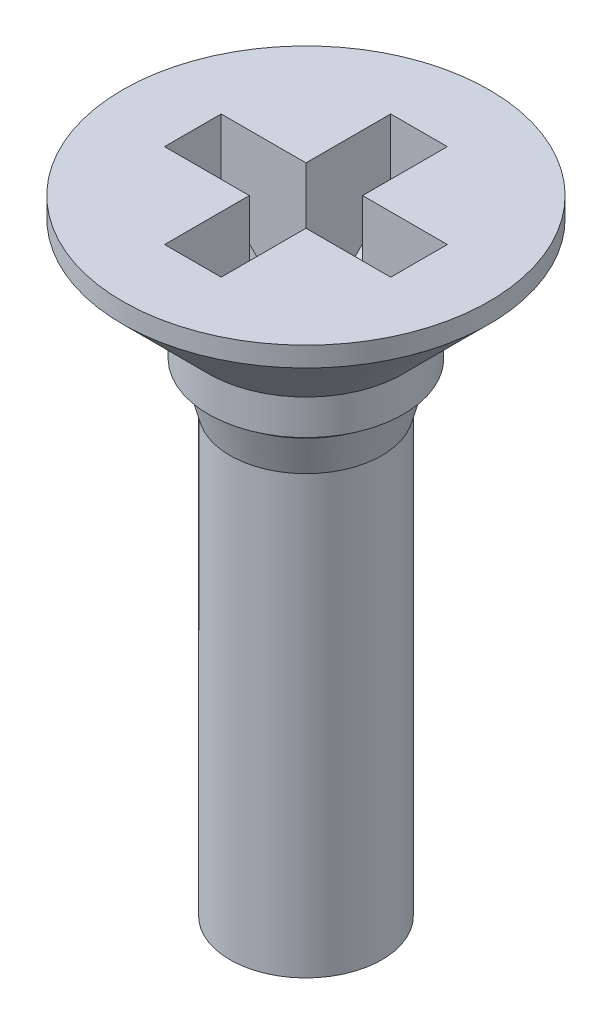
ISO-10303-21;
HEADER;
FILE_DESCRIPTION(('STEP AP214'),'2;1');
FILE_NAME('part.step','',(''),(''),'','','');
FILE_SCHEMA(('AUTOMOTIVE_DESIGN { 1 0 10303 214 1 1 1 1 }'));
ENDSEC;
DATA;
#1=APPLICATION_CONTEXT('core data for automotive mechanical design processes');
#2=APPLICATION_PROTOCOL_DEFINITION('international standard','automotive_design',2000,#1);
#3=PRODUCT_CONTEXT('',#1,'mechanical');
#4=PRODUCT('Part','Part','',(#3));
#5=PRODUCT_RELATED_PRODUCT_CATEGORY('part','',(#4));
#6=PRODUCT_DEFINITION_FORMATION('','',#4);
#7=PRODUCT_DEFINITION_CONTEXT('part definition',#1,'design');
#8=PRODUCT_DEFINITION('design','',#6,#7);
#9=PRODUCT_DEFINITION_SHAPE('','',#8);
#10=(LENGTH_UNIT() NAMED_UNIT(*) SI_UNIT(.MILLI.,.METRE.));
#11=(NAMED_UNIT(*) PLANE_ANGLE_UNIT() SI_UNIT($,.RADIAN.));
#12=(NAMED_UNIT(*) SI_UNIT($,.STERADIAN.) SOLID_ANGLE_UNIT());
#13=UNCERTAINTY_MEASURE_WITH_UNIT(LENGTH_MEASURE(1.E-05),#10,'distance_accuracy_value','');
#14=(GEOMETRIC_REPRESENTATION_CONTEXT(3) GLOBAL_UNCERTAINTY_ASSIGNED_CONTEXT((#13)) GLOBAL_UNIT_ASSIGNED_CONTEXT((#10,
#11,#12)) REPRESENTATION_CONTEXT('',''));
#15=CARTESIAN_POINT('',(0.,0.,0.));
#16=DIRECTION('',(0.,0.,1.));
#17=DIRECTION('',(1.,0.,0.));
#18=AXIS2_PLACEMENT_3D('',#15,#16,#17);
#19=CARTESIAN_POINT('',(0.,-2.35,-0.363));
#20=DIRECTION('',(0.,0.,-1.));
#21=DIRECTION('',(-1.,0.,0.));
#22=AXIS2_PLACEMENT_3D('',#19,#20,#21);
#23=PLANE('',#22);
#24=DIRECTION('',(0.,1.,0.));
#25=VECTOR('',#24,1.);
#26=CARTESIAN_POINT('',(0.363,-2.35,-0.363));
#27=LINE('',#26,#25);
#28=CARTESIAN_POINT('',(0.363,-1.8,-0.363));
#29=VERTEX_POINT('',#28);
#30=CARTESIAN_POINT('',(0.363,0.,-0.363));
#31=VERTEX_POINT('',#30);
#32=EDGE_CURVE('E196',#29,#31,#27,.T.);
#33=ORIENTED_EDGE('',*,*,#32,.F.);
#34=DIRECTION('',(1.,0.,0.));
#35=VECTOR('',#34,1.);
#36=CARTESIAN_POINT('',(-0.550000000000001,-1.8,-0.363));
#37=LINE('',#36,#35);
#38=CARTESIAN_POINT('',(0.550000000000001,-1.8,-0.363));
#39=VERTEX_POINT('',#38);
#40=EDGE_CURVE('E231',#29,#39,#37,.T.);
#41=ORIENTED_EDGE('',*,*,#40,.T.);
#42=DIRECTION('',(0.707106781186547,0.707106781186548,0.));
#43=VECTOR('',#42,1.);
#44=CARTESIAN_POINT('',(1.45,-0.9,-0.363));
#45=LINE('',#44,#43);
#46=CARTESIAN_POINT('',(1.45,-0.9,-0.363));
#47=VERTEX_POINT('',#46);
#48=EDGE_CURVE('E235',#39,#47,#45,.T.);
#49=ORIENTED_EDGE('',*,*,#48,.T.);
#50=DIRECTION('',(0.,1.,0.));
#51=VECTOR('',#50,1.);
#52=CARTESIAN_POINT('',(1.45,0.,-0.363));
#53=LINE('',#52,#51);
#54=CARTESIAN_POINT('',(1.45,0.,-0.363));
#55=VERTEX_POINT('',#54);
#56=EDGE_CURVE('E238',#47,#55,#53,.T.);
#57=ORIENTED_EDGE('',*,*,#56,.T.);
#58=DIRECTION('',(-1.,0.,0.));
#59=VECTOR('',#58,1.);
#60=CARTESIAN_POINT('',(1.45,0.,-0.363));
#61=LINE('',#60,#59);
#62=EDGE_CURVE('E242',#55,#31,#61,.T.);
#63=ORIENTED_EDGE('',*,*,#62,.T.);
#64=EDGE_LOOP('',(#33,#41,#49,#57,#63));
#65=FACE_BOUND('',#64,.T.);
#66=ADVANCED_FACE('F34',(#65),#23,.F.);
#67=CARTESIAN_POINT('',(0.,-2.35,0.363));
#68=DIRECTION('',(0.,0.,-1.));
#69=DIRECTION('',(-1.,0.,0.));
#70=AXIS2_PLACEMENT_3D('',#67,#68,#69);
#71=PLANE('',#70);
#72=DIRECTION('',(1.,0.,0.));
#73=VECTOR('',#72,1.);
#74=CARTESIAN_POINT('',(-0.550000000000001,-1.8,0.363));
#75=LINE('',#74,#73);
#76=CARTESIAN_POINT('',(0.363,-1.8,0.363));
#77=VERTEX_POINT('',#76);
#78=CARTESIAN_POINT('',(0.550000000000001,-1.8,0.363));
#79=VERTEX_POINT('',#78);
#80=EDGE_CURVE('E213',#77,#79,#75,.T.);
#81=ORIENTED_EDGE('',*,*,#80,.F.);
#82=DIRECTION('',(0.,1.,0.));
#83=VECTOR('',#82,1.);
#84=CARTESIAN_POINT('',(0.363,-2.35,0.363));
#85=LINE('',#84,#83);
#86=CARTESIAN_POINT('',(0.363,0.,0.363));
#87=VERTEX_POINT('',#86);
#88=EDGE_CURVE('E42',#77,#87,#85,.T.);
#89=ORIENTED_EDGE('',*,*,#88,.T.);
#90=DIRECTION('',(-1.,0.,0.));
#91=VECTOR('',#90,1.);
#92=CARTESIAN_POINT('',(1.45,0.,0.363));
#93=LINE('',#92,#91);
#94=CARTESIAN_POINT('',(1.45,0.,0.363));
#95=VERTEX_POINT('',#94);
#96=EDGE_CURVE('E222',#95,#87,#93,.T.);
#97=ORIENTED_EDGE('',*,*,#96,.F.);
#98=DIRECTION('',(0.,1.,0.));
#99=VECTOR('',#98,1.);
#100=CARTESIAN_POINT('',(1.45,0.,0.363));
#101=LINE('',#100,#99);
#102=CARTESIAN_POINT('',(1.45,-0.9,0.363));
#103=VERTEX_POINT('',#102);
#104=EDGE_CURVE('E219',#103,#95,#101,.T.);
#105=ORIENTED_EDGE('',*,*,#104,.F.);
#106=DIRECTION('',(0.707106781186547,0.707106781186548,0.));
#107=VECTOR('',#106,1.);
#108=CARTESIAN_POINT('',(1.45,-0.9,0.363));
#109=LINE('',#108,#107);
#110=EDGE_CURVE('E216',#79,#103,#109,.T.);
#111=ORIENTED_EDGE('',*,*,#110,.F.);
#112=EDGE_LOOP('',(#81,#89,#97,#105,#111));
#113=FACE_BOUND('',#112,.T.);
#114=ADVANCED_FACE('F288',(#113),#71,.T.);
#115=CARTESIAN_POINT('',(0.974000000000001,-8.,0.));
#116=DIRECTION('',(0.,1.,0.));
#117=DIRECTION('',(-1.,0.,0.));
#118=AXIS2_PLACEMENT_3D('',#115,#116,#117);
#119=PLANE('',#118);
#120=CARTESIAN_POINT('',(0.,-8.,0.));
#121=DIRECTION('',(0.,1.,0.));
#122=DIRECTION('',(-1.,0.,0.));
#123=AXIS2_PLACEMENT_3D('',#120,#121,#122);
#124=CIRCLE('',#123,0.974);
#125=CARTESIAN_POINT('',(-0.974,-8.,0.));
#126=VERTEX_POINT('',#125);
#127=EDGE_CURVE('E284',#126,#126,#124,.T.);
#128=ORIENTED_EDGE('',*,*,#127,.F.);
#129=EDGE_LOOP('',(#128));
#130=FACE_BOUND('',#129,.T.);
#131=ADVANCED_FACE('F36',(#130),#119,.F.);
#132=CARTESIAN_POINT('',(0.,0.,0.));
#133=DIRECTION('',(0.,1.,0.));
#134=DIRECTION('',(-1.,0.,0.));
#135=AXIS2_PLACEMENT_3D('',#132,#133,#134);
#136=CYLINDRICAL_SURFACE('',#135,0.974);
#137=CARTESIAN_POINT('',(0.,-2.4,0.));
#138=DIRECTION('',(0.,1.,0.));
#139=DIRECTION('',(-1.,0.,0.));
#140=AXIS2_PLACEMENT_3D('',#137,#138,#139);
#141=CIRCLE('',#140,0.974);
#142=CARTESIAN_POINT('',(-0.974,-2.4,0.));
#143=VERTEX_POINT('',#142);
#144=EDGE_CURVE('E281',#143,#143,#141,.T.);
#145=ORIENTED_EDGE('',*,*,#144,.F.);
#146=EDGE_LOOP('',(#145));
#147=FACE_BOUND('',#146,.T.);
#148=ORIENTED_EDGE('',*,*,#127,.T.);
#149=EDGE_LOOP('',(#148));
#150=FACE_BOUND('',#149,.T.);
#151=ADVANCED_FACE('F396',(#147,#150),#136,.T.);
#152=CARTESIAN_POINT('',(0.,-2.4,0.));
#153=DIRECTION('',(0.,1.,0.));
#154=DIRECTION('',(-1.,0.,0.));
#155=AXIS2_PLACEMENT_3D('',#152,#153,#154);
#156=CONICAL_SURFACE('',#155,0.974,0.26179938779915);
#157=CARTESIAN_POINT('',(0.,-1.91483339501605,0.));
#158=DIRECTION('',(0.,1.,0.));
#159=DIRECTION('',(-1.,0.,0.));
#160=AXIS2_PLACEMENT_3D('',#157,#158,#159);
#161=CIRCLE('',#160,1.104);
#162=CARTESIAN_POINT('',(-1.104,-1.91483339501605,0.));
#163=VERTEX_POINT('',#162);
#164=EDGE_CURVE('E278',#163,#163,#161,.T.);
#165=ORIENTED_EDGE('',*,*,#164,.F.);
#166=EDGE_LOOP('',(#165));
#167=FACE_BOUND('',#166,.T.);
#168=ORIENTED_EDGE('',*,*,#144,.T.);
#169=EDGE_LOOP('',(#168));
#170=FACE_BOUND('',#169,.T.);
#171=ADVANCED_FACE('F393',(#167,#170),#156,.T.);
#172=CARTESIAN_POINT('',(0.,0.,0.));
#173=DIRECTION('',(0.,1.,0.));
#174=DIRECTION('',(-1.,0.,0.));
#175=AXIS2_PLACEMENT_3D('',#172,#173,#174);
#176=CYLINDRICAL_SURFACE('',#175,1.104);
#177=CARTESIAN_POINT('',(0.,-1.804,0.));
#178=DIRECTION('',(0.,1.,0.));
#179=DIRECTION('',(-1.,0.,0.));
#180=AXIS2_PLACEMENT_3D('',#177,#178,#179);
#181=CIRCLE('',#180,1.104);
#182=CARTESIAN_POINT('',(-1.104,-1.804,0.));
#183=VERTEX_POINT('',#182);
#184=EDGE_CURVE('E275',#183,#183,#181,.T.);
#185=ORIENTED_EDGE('',*,*,#184,.F.);
#186=EDGE_LOOP('',(#185));
#187=FACE_BOUND('',#186,.T.);
#188=ORIENTED_EDGE('',*,*,#164,.T.);
#189=EDGE_LOOP('',(#188));
#190=FACE_BOUND('',#189,.T.);
#191=ADVANCED_FACE('F389',(#187,#190),#176,.T.);
#192=CARTESIAN_POINT('',(1.25,-1.804,0.));
#193=DIRECTION('',(0.,1.,0.));
#194=DIRECTION('',(-1.,0.,0.));
#195=AXIS2_PLACEMENT_3D('',#192,#193,#194);
#196=PLANE('',#195);
#197=CARTESIAN_POINT('',(0.,-1.804,0.));
#198=DIRECTION('',(0.,1.,0.));
#199=DIRECTION('',(-1.,0.,0.));
#200=AXIS2_PLACEMENT_3D('',#197,#198,#199);
#201=CIRCLE('',#200,1.25);
#202=CARTESIAN_POINT('',(-1.25,-1.804,0.));
#203=VERTEX_POINT('',#202);
#204=EDGE_CURVE('E272',#203,#203,#201,.T.);
#205=ORIENTED_EDGE('',*,*,#204,.F.);
#206=EDGE_LOOP('',(#205));
#207=FACE_BOUND('',#206,.T.);
#208=ORIENTED_EDGE('',*,*,#184,.T.);
#209=EDGE_LOOP('',(#208));
#210=FACE_BOUND('',#209,.T.);
#211=ADVANCED_FACE('F385',(#207,#210),#196,.F.);
#212=CARTESIAN_POINT('',(0.,0.,0.));
#213=DIRECTION('',(0.,1.,0.));
#214=DIRECTION('',(-1.,0.,0.));
#215=AXIS2_PLACEMENT_3D('',#212,#213,#214);
#216=CYLINDRICAL_SURFACE('',#215,1.25);
#217=CARTESIAN_POINT('',(0.,-1.354,0.));
#218=DIRECTION('',(0.,1.,0.));
#219=DIRECTION('',(-1.,0.,0.));
#220=AXIS2_PLACEMENT_3D('',#217,#218,#219);
#221=CIRCLE('',#220,1.25);
#222=CARTESIAN_POINT('',(-1.25,-1.354,0.));
#223=VERTEX_POINT('',#222);
#224=EDGE_CURVE('E269',#223,#223,#221,.T.);
#225=ORIENTED_EDGE('',*,*,#224,.F.);
#226=EDGE_LOOP('',(#225));
#227=FACE_BOUND('',#226,.T.);
#228=ORIENTED_EDGE('',*,*,#204,.T.);
#229=EDGE_LOOP('',(#228));
#230=FACE_BOUND('',#229,.T.);
#231=ADVANCED_FACE('F381',(#227,#230),#216,.T.);
#232=CARTESIAN_POINT('',(0.,-1.354,0.));
#233=DIRECTION('',(0.,1.,0.));
#234=DIRECTION('',(-1.,0.,0.));
#235=AXIS2_PLACEMENT_3D('',#232,#233,#234);
#236=CONICAL_SURFACE('',#235,1.25,0.78539816339745);
#237=CARTESIAN_POINT('',(0.,-0.254000000000005,0.));
#238=DIRECTION('',(0.,1.,0.));
#239=DIRECTION('',(-1.,0.,0.));
#240=AXIS2_PLACEMENT_3D('',#237,#238,#239);
#241=CIRCLE('',#240,2.35);
#242=CARTESIAN_POINT('',(-2.35,-0.254000000000006,0.));
#243=VERTEX_POINT('',#242);
#244=EDGE_CURVE('E266',#243,#243,#241,.T.);
#245=ORIENTED_EDGE('',*,*,#244,.F.);
#246=EDGE_LOOP('',(#245));
#247=FACE_BOUND('',#246,.T.);
#248=ORIENTED_EDGE('',*,*,#224,.T.);
#249=EDGE_LOOP('',(#248));
#250=FACE_BOUND('',#249,.T.);
#251=ADVANCED_FACE('F377',(#247,#250),#236,.T.);
#252=CARTESIAN_POINT('',(0.,0.,0.));
#253=DIRECTION('',(0.,1.,0.));
#254=DIRECTION('',(-1.,0.,0.));
#255=AXIS2_PLACEMENT_3D('',#252,#253,#254);
#256=CYLINDRICAL_SURFACE('',#255,2.35);
#257=CARTESIAN_POINT('',(0.,0.,0.));
#258=DIRECTION('',(0.,1.,0.));
#259=DIRECTION('',(-1.,0.,0.));
#260=AXIS2_PLACEMENT_3D('',#257,#258,#259);
#261=CIRCLE('',#260,2.35);
#262=CARTESIAN_POINT('',(-2.35,0.,0.));
#263=VERTEX_POINT('',#262);
#264=EDGE_CURVE('E251',#263,#263,#261,.T.);
#265=ORIENTED_EDGE('',*,*,#264,.F.);
#266=EDGE_LOOP('',(#265));
#267=FACE_BOUND('',#266,.T.);
#268=ORIENTED_EDGE('',*,*,#244,.T.);
#269=EDGE_LOOP('',(#268));
#270=FACE_BOUND('',#269,.T.);
#271=ADVANCED_FACE('F374',(#267,#270),#256,.T.);
#272=CARTESIAN_POINT('',(0.,0.,0.));
#273=DIRECTION('',(0.,-1.,0.));
#274=DIRECTION('',(1.,0.,0.));
#275=AXIS2_PLACEMENT_3D('',#272,#273,#274);
#276=PLANE('',#275);
#277=DIRECTION('',(1.,0.,0.));
#278=VECTOR('',#277,1.);
#279=CARTESIAN_POINT('',(-0.363,0.,1.45));
#280=LINE('',#279,#278);
#281=CARTESIAN_POINT('',(-0.363,0.,1.45));
#282=VERTEX_POINT('',#281);
#283=CARTESIAN_POINT('',(0.363,0.,1.45));
#284=VERTEX_POINT('',#283);
#285=EDGE_CURVE('E197',#282,#284,#280,.T.);
#286=ORIENTED_EDGE('',*,*,#285,.F.);
#287=DIRECTION('',(0.,0.,1.));
#288=VECTOR('',#287,1.);
#289=CARTESIAN_POINT('',(-0.363,0.,-1.45));
#290=LINE('',#289,#288);
#291=CARTESIAN_POINT('',(-0.363,0.,0.363));
#292=VERTEX_POINT('',#291);
#293=EDGE_CURVE('E190',#292,#282,#290,.T.);
#294=ORIENTED_EDGE('',*,*,#293,.F.);
#295=CARTESIAN_POINT('',(-1.45,0.,0.363));
#296=VERTEX_POINT('',#295);
#297=EDGE_CURVE('E221',#292,#296,#93,.T.);
#298=ORIENTED_EDGE('',*,*,#297,.T.);
#299=DIRECTION('',(0.,0.,1.));
#300=VECTOR('',#299,1.);
#301=CARTESIAN_POINT('',(-1.45,0.,-0.363));
#302=LINE('',#301,#300);
#303=CARTESIAN_POINT('',(-1.45,0.,-0.363));
#304=VERTEX_POINT('',#303);
#305=EDGE_CURVE('E252',#304,#296,#302,.T.);
#306=ORIENTED_EDGE('',*,*,#305,.F.);
#307=CARTESIAN_POINT('',(-0.363,0.,-0.363));
#308=VERTEX_POINT('',#307);
#309=EDGE_CURVE('E241',#308,#304,#61,.T.);
#310=ORIENTED_EDGE('',*,*,#309,.F.);
#311=CARTESIAN_POINT('',(-0.363,0.,-1.45));
#312=VERTEX_POINT('',#311);
#313=EDGE_CURVE('E191',#312,#308,#290,.T.);
#314=ORIENTED_EDGE('',*,*,#313,.F.);
#315=DIRECTION('',(1.,0.,0.));
#316=VECTOR('',#315,1.);
#317=CARTESIAN_POINT('',(-0.363,0.,-1.45));
#318=LINE('',#317,#316);
#319=CARTESIAN_POINT('',(0.363,0.,-1.45));
#320=VERTEX_POINT('',#319);
#321=EDGE_CURVE('E199',#312,#320,#318,.T.);
#322=ORIENTED_EDGE('',*,*,#321,.T.);
#323=DIRECTION('',(0.,0.,1.));
#324=VECTOR('',#323,1.);
#325=CARTESIAN_POINT('',(0.363,0.,-1.45));
#326=LINE('',#325,#324);
#327=EDGE_CURVE('E175',#320,#31,#326,.T.);
#328=ORIENTED_EDGE('',*,*,#327,.T.);
#329=ORIENTED_EDGE('',*,*,#62,.F.);
#330=DIRECTION('',(0.,0.,1.));
#331=VECTOR('',#330,1.);
#332=CARTESIAN_POINT('',(1.45,0.,-0.363));
#333=LINE('',#332,#331);
#334=EDGE_CURVE('E255',#55,#95,#333,.T.);
#335=ORIENTED_EDGE('',*,*,#334,.T.);
#336=ORIENTED_EDGE('',*,*,#96,.T.);
#337=EDGE_CURVE('E57',#87,#284,#326,.T.);
#338=ORIENTED_EDGE('',*,*,#337,.T.);
#339=EDGE_LOOP('',(#286,#294,#298,#306,#310,#314,#322,#328,#329,#335,#336,#338));
#340=FACE_BOUND('',#339,.T.);
#341=ORIENTED_EDGE('',*,*,#264,.T.);
#342=EDGE_LOOP('',(#341));
#343=FACE_BOUND('',#342,.T.);
#344=ADVANCED_FACE('F293',(#340,#343),#276,.F.);
#345=CARTESIAN_POINT('',(-1.45,-0.9,-0.363));
#346=DIRECTION('',(-0.707106781186548,-0.707106781186547,0.));
#347=DIRECTION('',(0.707106781186547,-0.707106781186548,0.));
#348=AXIS2_PLACEMENT_3D('',#345,#346,#347);
#349=PLANE('',#348);
#350=DIRECTION('',(0.,0.,1.));
#351=VECTOR('',#350,1.);
#352=CARTESIAN_POINT('',(-0.550000000000001,-1.8,-0.363));
#353=LINE('',#352,#351);
#354=CARTESIAN_POINT('',(-0.550000000000001,-1.8,-0.363));
#355=VERTEX_POINT('',#354);
#356=CARTESIAN_POINT('',(-0.550000000000001,-1.8,0.363));
#357=VERTEX_POINT('',#356);
#358=EDGE_CURVE('E248',#355,#357,#353,.T.);
#359=ORIENTED_EDGE('',*,*,#358,.F.);
#360=DIRECTION('',(0.707106781186547,-0.707106781186548,0.));
#361=VECTOR('',#360,1.);
#362=CARTESIAN_POINT('',(-1.45,-0.9,-0.363));
#363=LINE('',#362,#361);
#364=CARTESIAN_POINT('',(-1.45,-0.9,-0.363));
#365=VERTEX_POINT('',#364);
#366=EDGE_CURVE('E228',#365,#355,#363,.T.);
#367=ORIENTED_EDGE('',*,*,#366,.F.);
#368=DIRECTION('',(0.,0.,1.));
#369=VECTOR('',#368,1.);
#370=CARTESIAN_POINT('',(-1.45,-0.9,-0.363));
#371=LINE('',#370,#369);
#372=CARTESIAN_POINT('',(-1.45,-0.9,0.363));
#373=VERTEX_POINT('',#372);
#374=EDGE_CURVE('E249',#365,#373,#371,.T.);
#375=ORIENTED_EDGE('',*,*,#374,.T.);
#376=DIRECTION('',(0.707106781186547,-0.707106781186548,0.));
#377=VECTOR('',#376,1.);
#378=CARTESIAN_POINT('',(-1.45,-0.9,0.363));
#379=LINE('',#378,#377);
#380=EDGE_CURVE('E210',#373,#357,#379,.T.);
#381=ORIENTED_EDGE('',*,*,#380,.T.);
#382=EDGE_LOOP('',(#359,#367,#375,#381));
#383=FACE_BOUND('',#382,.T.);
#384=ADVANCED_FACE('F326',(#383),#349,.F.);
#385=CARTESIAN_POINT('',(-1.45,0.,-0.363));
#386=DIRECTION('',(-1.,0.,0.));
#387=DIRECTION('',(0.,0.,1.));
#388=AXIS2_PLACEMENT_3D('',#385,#386,#387);
#389=PLANE('',#388);
#390=ORIENTED_EDGE('',*,*,#374,.F.);
#391=DIRECTION('',(0.,-1.,0.));
#392=VECTOR('',#391,1.);
#393=CARTESIAN_POINT('',(-1.45,0.,-0.363));
#394=LINE('',#393,#392);
#395=EDGE_CURVE('E245',#304,#365,#394,.T.);
#396=ORIENTED_EDGE('',*,*,#395,.F.);
#397=ORIENTED_EDGE('',*,*,#305,.T.);
#398=DIRECTION('',(0.,-1.,0.));
#399=VECTOR('',#398,1.);
#400=CARTESIAN_POINT('',(-1.45,0.,0.363));
#401=LINE('',#400,#399);
#402=EDGE_CURVE('E225',#296,#373,#401,.T.);
#403=ORIENTED_EDGE('',*,*,#402,.T.);
#404=EDGE_LOOP('',(#390,#396,#397,#403));
#405=FACE_BOUND('',#404,.T.);
#406=ADVANCED_FACE('F371',(#405),#389,.F.);
#407=CARTESIAN_POINT('',(1.45,0.,-0.363));
#408=DIRECTION('',(1.,0.,0.));
#409=DIRECTION('',(0.,0.,-1.));
#410=AXIS2_PLACEMENT_3D('',#407,#408,#409);
#411=PLANE('',#410);
#412=ORIENTED_EDGE('',*,*,#334,.F.);
#413=ORIENTED_EDGE('',*,*,#56,.F.);
#414=DIRECTION('',(0.,0.,1.));
#415=VECTOR('',#414,1.);
#416=CARTESIAN_POINT('',(1.45,-0.9,-0.363));
#417=LINE('',#416,#415);
#418=EDGE_CURVE('E258',#47,#103,#417,.T.);
#419=ORIENTED_EDGE('',*,*,#418,.T.);
#420=ORIENTED_EDGE('',*,*,#104,.T.);
#421=EDGE_LOOP('',(#412,#413,#419,#420));
#422=FACE_BOUND('',#421,.T.);
#423=ADVANCED_FACE('F298',(#422),#411,.F.);
#424=CARTESIAN_POINT('',(1.45,-0.9,-0.363));
#425=DIRECTION('',(0.707106781186548,-0.707106781186547,0.));
#426=DIRECTION('',(0.707106781186547,0.707106781186548,0.));
#427=AXIS2_PLACEMENT_3D('',#424,#425,#426);
#428=PLANE('',#427);
#429=ORIENTED_EDGE('',*,*,#418,.F.);
#430=ORIENTED_EDGE('',*,*,#48,.F.);
#431=DIRECTION('',(0.,0.,1.));
#432=VECTOR('',#431,1.);
#433=CARTESIAN_POINT('',(0.550000000000001,-1.8,-0.363));
#434=LINE('',#433,#432);
#435=EDGE_CURVE('E260',#39,#79,#434,.T.);
#436=ORIENTED_EDGE('',*,*,#435,.T.);
#437=ORIENTED_EDGE('',*,*,#110,.T.);
#438=EDGE_LOOP('',(#429,#430,#436,#437));
#439=FACE_BOUND('',#438,.T.);
#440=ADVANCED_FACE('F304',(#439),#428,.F.);
#441=CARTESIAN_POINT('',(-0.550000000000001,-1.8,-0.363));
#442=DIRECTION('',(0.,-1.,0.));
#443=DIRECTION('',(0.,0.,-1.));
#444=AXIS2_PLACEMENT_3D('',#441,#442,#443);
#445=PLANE('',#444);
#446=CARTESIAN_POINT('',(-0.363,-1.8,0.363));
#447=VERTEX_POINT('',#446);
#448=EDGE_CURVE('E214',#357,#447,#75,.T.);
#449=ORIENTED_EDGE('',*,*,#448,.T.);
#450=DIRECTION('',(0.,0.,-1.));
#451=VECTOR('',#450,1.);
#452=CARTESIAN_POINT('',(-0.363,-1.8,0.550000000000001));
#453=LINE('',#452,#451);
#454=CARTESIAN_POINT('',(-0.363,-1.8,0.550000000000001));
#455=VERTEX_POINT('',#454);
#456=EDGE_CURVE('E153',#455,#447,#453,.T.);
#457=ORIENTED_EDGE('',*,*,#456,.F.);
#458=DIRECTION('',(1.,0.,0.));
#459=VECTOR('',#458,1.);
#460=CARTESIAN_POINT('',(-0.363,-1.8,0.550000000000001));
#461=LINE('',#460,#459);
#462=CARTESIAN_POINT('',(0.363,-1.8,0.550000000000001));
#463=VERTEX_POINT('',#462);
#464=EDGE_CURVE('E147',#455,#463,#461,.T.);
#465=ORIENTED_EDGE('',*,*,#464,.T.);
#466=DIRECTION('',(0.,0.,-1.));
#467=VECTOR('',#466,1.);
#468=CARTESIAN_POINT('',(0.363,-1.8,0.550000000000001));
#469=LINE('',#468,#467);
#470=EDGE_CURVE('E151',#463,#77,#469,.T.);
#471=ORIENTED_EDGE('',*,*,#470,.T.);
#472=ORIENTED_EDGE('',*,*,#80,.T.);
#473=ORIENTED_EDGE('',*,*,#435,.F.);
#474=ORIENTED_EDGE('',*,*,#40,.F.);
#475=CARTESIAN_POINT('',(0.363,-1.8,-0.550000000000001));
#476=VERTEX_POINT('',#475);
#477=EDGE_CURVE('E49',#29,#476,#469,.T.);
#478=ORIENTED_EDGE('',*,*,#477,.T.);
#479=DIRECTION('',(1.,0.,0.));
#480=VECTOR('',#479,1.);
#481=CARTESIAN_POINT('',(-0.363,-1.8,-0.550000000000001));
#482=LINE('',#481,#480);
#483=CARTESIAN_POINT('',(-0.363,-1.8,-0.550000000000001));
#484=VERTEX_POINT('',#483);
#485=EDGE_CURVE('E158',#484,#476,#482,.T.);
#486=ORIENTED_EDGE('',*,*,#485,.F.);
#487=CARTESIAN_POINT('',(-0.363,-1.8,-0.363));
#488=VERTEX_POINT('',#487);
#489=EDGE_CURVE('E182',#488,#484,#453,.T.);
#490=ORIENTED_EDGE('',*,*,#489,.F.);
#491=EDGE_CURVE('E232',#355,#488,#37,.T.);
#492=ORIENTED_EDGE('',*,*,#491,.F.);
#493=ORIENTED_EDGE('',*,*,#358,.T.);
#494=EDGE_LOOP('',(#449,#457,#465,#471,#472,#473,#474,#478,#486,#490,#492,#493));
#495=FACE_BOUND('',#494,.T.);
#496=ADVANCED_FACE('F150',(#495),#445,.F.);
#497=ORIENTED_EDGE('',*,*,#491,.T.);
#498=DIRECTION('',(0.,1.,0.));
#499=VECTOR('',#498,1.);
#500=CARTESIAN_POINT('',(-0.363,-2.35,-0.363));
#501=LINE('',#500,#499);
#502=EDGE_CURVE('E207',#488,#308,#501,.T.);
#503=ORIENTED_EDGE('',*,*,#502,.T.);
#504=ORIENTED_EDGE('',*,*,#309,.T.);
#505=ORIENTED_EDGE('',*,*,#395,.T.);
#506=ORIENTED_EDGE('',*,*,#366,.T.);
#507=EDGE_LOOP('',(#497,#503,#504,#505,#506));
#508=FACE_BOUND('',#507,.T.);
#509=ADVANCED_FACE('F321',(#508),#23,.F.);
#510=DIRECTION('',(0.,1.,0.));
#511=VECTOR('',#510,1.);
#512=CARTESIAN_POINT('',(-0.363,-2.35,0.363));
#513=LINE('',#512,#511);
#514=EDGE_CURVE('E11',#447,#292,#513,.T.);
#515=ORIENTED_EDGE('',*,*,#514,.F.);
#516=ORIENTED_EDGE('',*,*,#448,.F.);
#517=ORIENTED_EDGE('',*,*,#380,.F.);
#518=ORIENTED_EDGE('',*,*,#402,.F.);
#519=ORIENTED_EDGE('',*,*,#297,.F.);
#520=EDGE_LOOP('',(#515,#516,#517,#518,#519));
#521=FACE_BOUND('',#520,.T.);
#522=ADVANCED_FACE('F331',(#521),#71,.T.);
#523=CARTESIAN_POINT('',(-0.363,-0.9,1.45));
#524=DIRECTION('',(0.,-0.707106781186547,0.707106781186548));
#525=DIRECTION('',(0.,-0.707106781186548,-0.707106781186547));
#526=AXIS2_PLACEMENT_3D('',#523,#524,#525);
#527=PLANE('',#526);
#528=ORIENTED_EDGE('',*,*,#464,.F.);
#529=DIRECTION('',(0.,-0.707106781186548,-0.707106781186547));
#530=VECTOR('',#529,1.);
#531=CARTESIAN_POINT('',(-0.363,-0.9,1.45));
#532=LINE('',#531,#530);
#533=CARTESIAN_POINT('',(-0.363,-0.9,1.45));
#534=VERTEX_POINT('',#533);
#535=EDGE_CURVE('E180',#534,#455,#532,.T.);
#536=ORIENTED_EDGE('',*,*,#535,.F.);
#537=DIRECTION('',(1.,0.,0.));
#538=VECTOR('',#537,1.);
#539=CARTESIAN_POINT('',(-0.363,-0.9,1.45));
#540=LINE('',#539,#538);
#541=CARTESIAN_POINT('',(0.363,-0.9,1.45));
#542=VERTEX_POINT('',#541);
#543=EDGE_CURVE('E167',#534,#542,#540,.T.);
#544=ORIENTED_EDGE('',*,*,#543,.T.);
#545=DIRECTION('',(0.,-0.707106781186548,-0.707106781186547));
#546=VECTOR('',#545,1.);
#547=CARTESIAN_POINT('',(0.363,-0.9,1.45));
#548=LINE('',#547,#546);
#549=EDGE_CURVE('E163',#542,#463,#548,.T.);
#550=ORIENTED_EDGE('',*,*,#549,.T.);
#551=EDGE_LOOP('',(#528,#536,#544,#550));
#552=FACE_BOUND('',#551,.T.);
#553=ADVANCED_FACE('F166',(#552),#527,.F.);
#554=CARTESIAN_POINT('',(-0.363,-2.35,0.));
#555=DIRECTION('',(-1.,0.,0.));
#556=DIRECTION('',(0.,0.,1.));
#557=AXIS2_PLACEMENT_3D('',#554,#555,#556);
#558=PLANE('',#557);
#559=ORIENTED_EDGE('',*,*,#514,.T.);
#560=ORIENTED_EDGE('',*,*,#293,.T.);
#561=DIRECTION('',(0.,-1.,0.));
#562=VECTOR('',#561,1.);
#563=CARTESIAN_POINT('',(-0.363,0.,1.45));
#564=LINE('',#563,#562);
#565=EDGE_CURVE('E159',#282,#534,#564,.T.);
#566=ORIENTED_EDGE('',*,*,#565,.T.);
#567=ORIENTED_EDGE('',*,*,#535,.T.);
#568=ORIENTED_EDGE('',*,*,#456,.T.);
#569=EDGE_LOOP('',(#559,#560,#566,#567,#568));
#570=FACE_BOUND('',#569,.T.);
#571=ADVANCED_FACE('F336',(#570),#558,.F.);
#572=CARTESIAN_POINT('',(0.363,-2.35,0.));
#573=DIRECTION('',(-1.,0.,0.));
#574=DIRECTION('',(0.,0.,1.));
#575=AXIS2_PLACEMENT_3D('',#572,#573,#574);
#576=PLANE('',#575);
#577=ORIENTED_EDGE('',*,*,#470,.F.);
#578=ORIENTED_EDGE('',*,*,#549,.F.);
#579=DIRECTION('',(0.,-1.,0.));
#580=VECTOR('',#579,1.);
#581=CARTESIAN_POINT('',(0.363,0.,1.45));
#582=LINE('',#581,#580);
#583=EDGE_CURVE('E178',#284,#542,#582,.T.);
#584=ORIENTED_EDGE('',*,*,#583,.F.);
#585=ORIENTED_EDGE('',*,*,#337,.F.);
#586=ORIENTED_EDGE('',*,*,#88,.F.);
#587=EDGE_LOOP('',(#577,#578,#584,#585,#586));
#588=FACE_BOUND('',#587,.T.);
#589=ADVANCED_FACE('F162',(#588),#576,.T.);
#590=CARTESIAN_POINT('',(-0.363,0.,1.45));
#591=DIRECTION('',(0.,0.,1.));
#592=DIRECTION('',(1.,0.,0.));
#593=AXIS2_PLACEMENT_3D('',#590,#591,#592);
#594=PLANE('',#593);
#595=ORIENTED_EDGE('',*,*,#543,.F.);
#596=ORIENTED_EDGE('',*,*,#565,.F.);
#597=ORIENTED_EDGE('',*,*,#285,.T.);
#598=ORIENTED_EDGE('',*,*,#583,.T.);
#599=EDGE_LOOP('',(#595,#596,#597,#598));
#600=FACE_BOUND('',#599,.T.);
#601=ADVANCED_FACE('F340',(#600),#594,.F.);
#602=ORIENTED_EDGE('',*,*,#489,.T.);
#603=DIRECTION('',(0.,0.707106781186548,-0.707106781186547));
#604=VECTOR('',#603,1.);
#605=CARTESIAN_POINT('',(-0.363,-0.9,-1.45));
#606=LINE('',#605,#604);
#607=CARTESIAN_POINT('',(-0.363,-0.9,-1.45));
#608=VERTEX_POINT('',#607);
#609=EDGE_CURVE('E184',#484,#608,#606,.T.);
#610=ORIENTED_EDGE('',*,*,#609,.T.);
#611=DIRECTION('',(0.,1.,0.));
#612=VECTOR('',#611,1.);
#613=CARTESIAN_POINT('',(-0.363,0.,-1.45));
#614=LINE('',#613,#612);
#615=EDGE_CURVE('E187',#608,#312,#614,.T.);
#616=ORIENTED_EDGE('',*,*,#615,.T.);
#617=ORIENTED_EDGE('',*,*,#313,.T.);
#618=ORIENTED_EDGE('',*,*,#502,.F.);
#619=EDGE_LOOP('',(#602,#610,#616,#617,#618));
#620=FACE_BOUND('',#619,.T.);
#621=ADVANCED_FACE('F318',(#620),#558,.F.);
#622=ORIENTED_EDGE('',*,*,#32,.T.);
#623=ORIENTED_EDGE('',*,*,#327,.F.);
#624=DIRECTION('',(0.,1.,0.));
#625=VECTOR('',#624,1.);
#626=CARTESIAN_POINT('',(0.363,0.,-1.45));
#627=LINE('',#626,#625);
#628=CARTESIAN_POINT('',(0.363,-0.9,-1.45));
#629=VERTEX_POINT('',#628);
#630=EDGE_CURVE('E173',#629,#320,#627,.T.);
#631=ORIENTED_EDGE('',*,*,#630,.F.);
#632=DIRECTION('',(0.,0.707106781186548,-0.707106781186547));
#633=VECTOR('',#632,1.);
#634=CARTESIAN_POINT('',(0.363,-0.9,-1.45));
#635=LINE('',#634,#633);
#636=EDGE_CURVE('E164',#476,#629,#635,.T.);
#637=ORIENTED_EDGE('',*,*,#636,.F.);
#638=ORIENTED_EDGE('',*,*,#477,.F.);
#639=EDGE_LOOP('',(#622,#623,#631,#637,#638));
#640=FACE_BOUND('',#639,.T.);
#641=ADVANCED_FACE('F311',(#640),#576,.T.);
#642=CARTESIAN_POINT('',(-0.363,0.,-1.45));
#643=DIRECTION('',(0.,0.,-1.));
#644=DIRECTION('',(-1.,0.,0.));
#645=AXIS2_PLACEMENT_3D('',#642,#643,#644);
#646=PLANE('',#645);
#647=ORIENTED_EDGE('',*,*,#321,.F.);
#648=ORIENTED_EDGE('',*,*,#615,.F.);
#649=DIRECTION('',(1.,0.,0.));
#650=VECTOR('',#649,1.);
#651=CARTESIAN_POINT('',(-0.363,-0.9,-1.45));
#652=LINE('',#651,#650);
#653=EDGE_CURVE('E202',#608,#629,#652,.T.);
#654=ORIENTED_EDGE('',*,*,#653,.T.);
#655=ORIENTED_EDGE('',*,*,#630,.T.);
#656=EDGE_LOOP('',(#647,#648,#654,#655));
#657=FACE_BOUND('',#656,.T.);
#658=ADVANCED_FACE('F314',(#657),#646,.F.);
#659=CARTESIAN_POINT('',(-0.363,-0.9,-1.45));
#660=DIRECTION('',(0.,-0.707106781186547,-0.707106781186548));
#661=DIRECTION('',(0.,0.707106781186548,-0.707106781186547));
#662=AXIS2_PLACEMENT_3D('',#659,#660,#661);
#663=PLANE('',#662);
#664=ORIENTED_EDGE('',*,*,#653,.F.);
#665=ORIENTED_EDGE('',*,*,#609,.F.);
#666=ORIENTED_EDGE('',*,*,#485,.T.);
#667=ORIENTED_EDGE('',*,*,#636,.T.);
#668=EDGE_LOOP('',(#664,#665,#666,#667));
#669=FACE_BOUND('',#668,.T.);
#670=ADVANCED_FACE('F309',(#669),#663,.F.);
#671=CLOSED_SHELL('',(#66,#114,#131,#151,#171,#191,#211,#231,#251,#271,#344,#384,#406,#423,#440,
#496,#509,#522,#553,#571,#589,#601,#621,#641,#658,#670));
#672=MANIFOLD_SOLID_BREP('B2',#671);
#673=ADVANCED_BREP_SHAPE_REPRESENTATION('',(#18,#672),#14);
#674=SHAPE_DEFINITION_REPRESENTATION(#9,#673);
ENDSEC;
END-ISO-10303-21;
